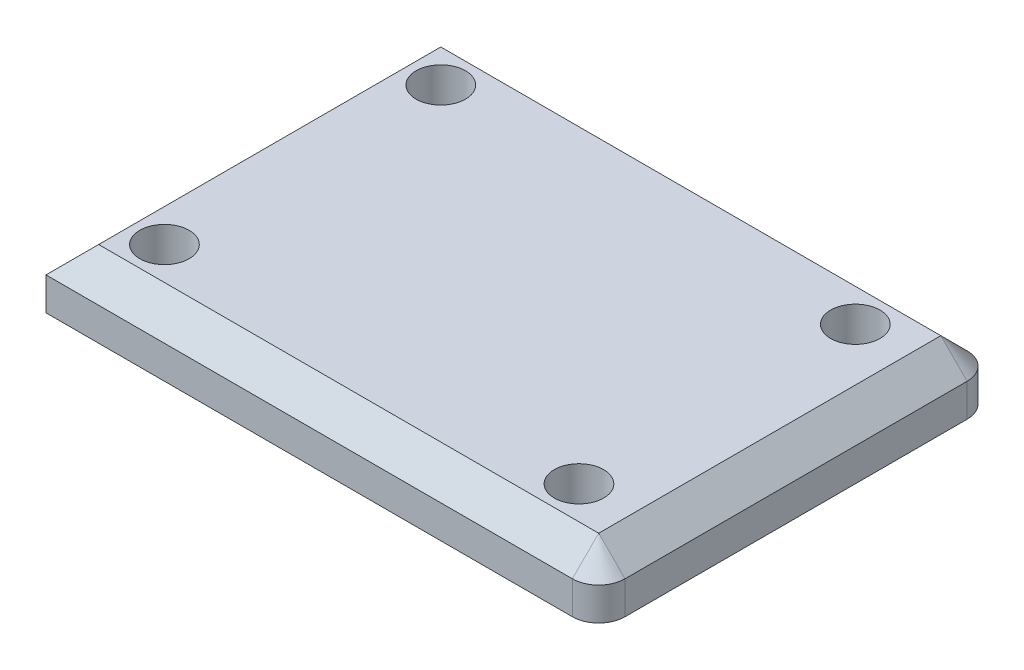
ISO-10303-21;
HEADER;
FILE_DESCRIPTION(('STEP AP214'),'2;1');
FILE_NAME('part.step','',(''),(''),'','','');
FILE_SCHEMA(('AUTOMOTIVE_DESIGN { 1 0 10303 214 1 1 1 1 }'));
ENDSEC;
DATA;
#1=APPLICATION_CONTEXT('core data for automotive mechanical design processes');
#2=APPLICATION_PROTOCOL_DEFINITION('international standard','automotive_design',2000,#1);
#3=PRODUCT_CONTEXT('',#1,'mechanical');
#4=PRODUCT('Part','Part','',(#3));
#5=PRODUCT_RELATED_PRODUCT_CATEGORY('part','',(#4));
#6=PRODUCT_DEFINITION_FORMATION('','',#4);
#7=PRODUCT_DEFINITION_CONTEXT('part definition',#1,'design');
#8=PRODUCT_DEFINITION('design','',#6,#7);
#9=PRODUCT_DEFINITION_SHAPE('','',#8);
#10=(LENGTH_UNIT() NAMED_UNIT(*) SI_UNIT(.MILLI.,.METRE.));
#11=(NAMED_UNIT(*) PLANE_ANGLE_UNIT() SI_UNIT($,.RADIAN.));
#12=(NAMED_UNIT(*) SI_UNIT($,.STERADIAN.) SOLID_ANGLE_UNIT());
#13=UNCERTAINTY_MEASURE_WITH_UNIT(LENGTH_MEASURE(1.E-05),#10,'distance_accuracy_value','');
#14=(GEOMETRIC_REPRESENTATION_CONTEXT(3) GLOBAL_UNCERTAINTY_ASSIGNED_CONTEXT((#13)) GLOBAL_UNIT_ASSIGNED_CONTEXT((#10,
#11,#12)) REPRESENTATION_CONTEXT('',''));
#15=CARTESIAN_POINT('',(0.,0.,0.));
#16=DIRECTION('',(0.,0.,1.));
#17=DIRECTION('',(1.,0.,0.));
#18=AXIS2_PLACEMENT_3D('',#15,#16,#17);
#19=CARTESIAN_POINT('',(-21.0090841155592,3.75,15.));
#20=DIRECTION('',(1.,0.,0.));
#21=DIRECTION('',(0.,0.,-1.));
#22=AXIS2_PLACEMENT_3D('',#19,#20,#21);
#23=PLANE('',#22);
#24=DIRECTION('',(0.,-1.,0.));
#25=VECTOR('',#24,1.);
#26=CARTESIAN_POINT('',(-21.0090841155592,3.75,15.));
#27=LINE('',#26,#25);
#28=CARTESIAN_POINT('',(-21.0090841155592,1.74999999999998,15.));
#29=VERTEX_POINT('',#28);
#30=CARTESIAN_POINT('',(-21.0090841155592,-0.75,15.));
#31=VERTEX_POINT('',#30);
#32=EDGE_CURVE('E106',#29,#31,#27,.T.);
#33=ORIENTED_EDGE('',*,*,#32,.F.);
#34=DIRECTION('',(0.,0.,-1.));
#35=VECTOR('',#34,1.);
#36=CARTESIAN_POINT('',(-21.0090841155592,1.74999999999998,-15.));
#37=LINE('',#36,#35);
#38=CARTESIAN_POINT('',(-21.0090841155592,1.74999999999998,-15.));
#39=VERTEX_POINT('',#38);
#40=EDGE_CURVE('E11',#29,#39,#37,.T.);
#41=ORIENTED_EDGE('',*,*,#40,.T.);
#42=DIRECTION('',(0.,-1.,0.));
#43=VECTOR('',#42,1.);
#44=CARTESIAN_POINT('',(-21.0090841155592,3.75,-15.));
#45=LINE('',#44,#43);
#46=CARTESIAN_POINT('',(-21.0090841155592,-0.75,-15.));
#47=VERTEX_POINT('',#46);
#48=EDGE_CURVE('E116',#39,#47,#45,.T.);
#49=ORIENTED_EDGE('',*,*,#48,.T.);
#50=DIRECTION('',(0.,0.,1.));
#51=VECTOR('',#50,1.);
#52=CARTESIAN_POINT('',(-21.0090841155592,-0.75,15.));
#53=LINE('',#52,#51);
#54=EDGE_CURVE('E123',#47,#31,#53,.T.);
#55=ORIENTED_EDGE('',*,*,#54,.T.);
#56=EDGE_LOOP('',(#33,#41,#49,#55));
#57=FACE_BOUND('',#56,.T.);
#58=ADVANCED_FACE('F40',(#57),#23,.F.);
#59=CARTESIAN_POINT('',(20.9909158844408,3.75,15.));
#60=DIRECTION('',(0.,0.,-1.));
#61=DIRECTION('',(-1.,0.,0.));
#62=AXIS2_PLACEMENT_3D('',#59,#60,#61);
#63=PLANE('',#62);
#64=DIRECTION('',(0.,-1.,0.));
#65=VECTOR('',#64,1.);
#66=CARTESIAN_POINT('',(18.9909158844408,3.75,15.));
#67=LINE('',#66,#65);
#68=CARTESIAN_POINT('',(18.9909158844408,-0.75,15.));
#69=VERTEX_POINT('',#68);
#70=CARTESIAN_POINT('',(18.9909158844408,1.74999999999998,15.));
#71=VERTEX_POINT('',#70);
#72=EDGE_CURVE('E148',#69,#71,#67,.F.);
#73=ORIENTED_EDGE('',*,*,#72,.T.);
#74=DIRECTION('',(-1.,0.,0.));
#75=VECTOR('',#74,1.);
#76=CARTESIAN_POINT('',(-21.0090841155592,1.74999999999998,15.));
#77=LINE('',#76,#75);
#78=EDGE_CURVE('E113',#71,#29,#77,.T.);
#79=ORIENTED_EDGE('',*,*,#78,.T.);
#80=ORIENTED_EDGE('',*,*,#32,.T.);
#81=DIRECTION('',(1.,0.,0.));
#82=VECTOR('',#81,1.);
#83=CARTESIAN_POINT('',(20.9909158844408,-0.75,15.));
#84=LINE('',#83,#82);
#85=EDGE_CURVE('E110',#31,#69,#84,.T.);
#86=ORIENTED_EDGE('',*,*,#85,.T.);
#87=EDGE_LOOP('',(#73,#79,#80,#86));
#88=FACE_BOUND('',#87,.T.);
#89=ADVANCED_FACE('F109',(#88),#63,.F.);
#90=CARTESIAN_POINT('',(20.9909158844408,3.75,15.));
#91=DIRECTION('',(-1.,0.,0.));
#92=DIRECTION('',(0.,0.,1.));
#93=AXIS2_PLACEMENT_3D('',#90,#91,#92);
#94=PLANE('',#93);
#95=DIRECTION('',(0.,-1.,0.));
#96=VECTOR('',#95,1.);
#97=CARTESIAN_POINT('',(20.9909158844408,3.75,-13.));
#98=LINE('',#97,#96);
#99=CARTESIAN_POINT('',(20.9909158844408,-0.75,-13.));
#100=VERTEX_POINT('',#99);
#101=CARTESIAN_POINT('',(20.9909158844408,1.74999999999998,-13.));
#102=VERTEX_POINT('',#101);
#103=EDGE_CURVE('E115',#100,#102,#98,.F.);
#104=ORIENTED_EDGE('',*,*,#103,.T.);
#105=DIRECTION('',(0.,0.,1.));
#106=VECTOR('',#105,1.);
#107=CARTESIAN_POINT('',(20.9909158844408,1.74999999999998,13.));
#108=LINE('',#107,#106);
#109=CARTESIAN_POINT('',(20.9909158844408,1.74999999999998,13.));
#110=VERTEX_POINT('',#109);
#111=EDGE_CURVE('E164',#102,#110,#108,.T.);
#112=ORIENTED_EDGE('',*,*,#111,.T.);
#113=DIRECTION('',(0.,-1.,0.));
#114=VECTOR('',#113,1.);
#115=CARTESIAN_POINT('',(20.9909158844408,3.75,13.));
#116=LINE('',#115,#114);
#117=CARTESIAN_POINT('',(20.9909158844408,-0.75,13.));
#118=VERTEX_POINT('',#117);
#119=EDGE_CURVE('E143',#110,#118,#116,.T.);
#120=ORIENTED_EDGE('',*,*,#119,.T.);
#121=DIRECTION('',(0.,0.,-1.));
#122=VECTOR('',#121,1.);
#123=CARTESIAN_POINT('',(20.9909158844408,-0.75,15.));
#124=LINE('',#123,#122);
#125=EDGE_CURVE('E126',#118,#100,#124,.T.);
#126=ORIENTED_EDGE('',*,*,#125,.T.);
#127=EDGE_LOOP('',(#104,#112,#120,#126));
#128=FACE_BOUND('',#127,.T.);
#129=ADVANCED_FACE('F224',(#128),#94,.F.);
#130=CARTESIAN_POINT('',(20.9909158844408,3.75,-15.));
#131=DIRECTION('',(0.,0.,1.));
#132=DIRECTION('',(1.,0.,0.));
#133=AXIS2_PLACEMENT_3D('',#130,#131,#132);
#134=PLANE('',#133);
#135=ORIENTED_EDGE('',*,*,#48,.F.);
#136=DIRECTION('',(1.,0.,0.));
#137=VECTOR('',#136,1.);
#138=CARTESIAN_POINT('',(18.9909158844408,1.74999999999998,-15.));
#139=LINE('',#138,#137);
#140=CARTESIAN_POINT('',(18.9909158844408,1.74999999999998,-15.));
#141=VERTEX_POINT('',#140);
#142=EDGE_CURVE('E50',#39,#141,#139,.T.);
#143=ORIENTED_EDGE('',*,*,#142,.T.);
#144=DIRECTION('',(0.,-1.,0.));
#145=VECTOR('',#144,1.);
#146=CARTESIAN_POINT('',(18.9909158844408,3.75,-15.));
#147=LINE('',#146,#145);
#148=CARTESIAN_POINT('',(18.9909158844408,-0.75,-15.));
#149=VERTEX_POINT('',#148);
#150=EDGE_CURVE('E150',#141,#149,#147,.T.);
#151=ORIENTED_EDGE('',*,*,#150,.T.);
#152=DIRECTION('',(-1.,0.,0.));
#153=VECTOR('',#152,1.);
#154=CARTESIAN_POINT('',(20.9909158844408,-0.75,-15.));
#155=LINE('',#154,#153);
#156=EDGE_CURVE('E138',#149,#47,#155,.T.);
#157=ORIENTED_EDGE('',*,*,#156,.T.);
#158=EDGE_LOOP('',(#135,#143,#151,#157));
#159=FACE_BOUND('',#158,.T.);
#160=ADVANCED_FACE('F215',(#159),#134,.F.);
#161=CARTESIAN_POINT('',(-0.00908411555917917,3.75,0.));
#162=DIRECTION('',(0.,1.,0.));
#163=DIRECTION('',(0.,0.,1.));
#164=AXIS2_PLACEMENT_3D('',#161,#162,#163);
#165=PLANE('',#164);
#166=DIRECTION('',(0.,0.,1.));
#167=VECTOR('',#166,1.);
#168=CARTESIAN_POINT('',(-19.0090841155592,3.75,15.));
#169=LINE('',#168,#167);
#170=CARTESIAN_POINT('',(-19.0090841155592,3.75,-13.));
#171=VERTEX_POINT('',#170);
#172=CARTESIAN_POINT('',(-19.0090841155592,3.75,13.));
#173=VERTEX_POINT('',#172);
#174=EDGE_CURVE('E152',#171,#173,#169,.T.);
#175=ORIENTED_EDGE('',*,*,#174,.T.);
#176=DIRECTION('',(1.,0.,0.));
#177=VECTOR('',#176,1.);
#178=CARTESIAN_POINT('',(18.9909158844408,3.75,13.));
#179=LINE('',#178,#177);
#180=CARTESIAN_POINT('',(18.9909158844408,3.75,13.));
#181=VERTEX_POINT('',#180);
#182=EDGE_CURVE('E158',#173,#181,#179,.T.);
#183=ORIENTED_EDGE('',*,*,#182,.T.);
#184=DIRECTION('',(0.,0.,-1.));
#185=VECTOR('',#184,1.);
#186=CARTESIAN_POINT('',(18.9909158844408,3.75,-13.));
#187=LINE('',#186,#185);
#188=CARTESIAN_POINT('',(18.9909158844408,3.75,-13.));
#189=VERTEX_POINT('',#188);
#190=EDGE_CURVE('E156',#181,#189,#187,.T.);
#191=ORIENTED_EDGE('',*,*,#190,.T.);
#192=DIRECTION('',(-1.,0.,0.));
#193=VECTOR('',#192,1.);
#194=CARTESIAN_POINT('',(-21.0090841155592,3.75,-13.));
#195=LINE('',#194,#193);
#196=EDGE_CURVE('E154',#189,#171,#195,.T.);
#197=ORIENTED_EDGE('',*,*,#196,.T.);
#198=EDGE_LOOP('',(#175,#183,#191,#197));
#199=FACE_BOUND('',#198,.T.);
#200=CARTESIAN_POINT('',(-16.5090841155592,3.75,-10.5));
#201=DIRECTION('',(0.,1.,0.));
#202=DIRECTION('',(0.,0.,1.));
#203=AXIS2_PLACEMENT_3D('',#200,#201,#202);
#204=CIRCLE('',#203,1.875);
#205=CARTESIAN_POINT('',(-16.5090841155592,3.75,-8.62500000000001));
#206=VERTEX_POINT('',#205);
#207=EDGE_CURVE('E186',#206,#206,#204,.T.);
#208=ORIENTED_EDGE('',*,*,#207,.F.);
#209=EDGE_LOOP('',(#208));
#210=FACE_BOUND('',#209,.T.);
#211=CARTESIAN_POINT('',(-16.5090841155592,3.75,10.5));
#212=DIRECTION('',(0.,1.,0.));
#213=DIRECTION('',(0.,0.,1.));
#214=AXIS2_PLACEMENT_3D('',#211,#212,#213);
#215=CIRCLE('',#214,1.875);
#216=CARTESIAN_POINT('',(-16.5090841155592,3.75,12.375));
#217=VERTEX_POINT('',#216);
#218=EDGE_CURVE('E195',#217,#217,#215,.T.);
#219=ORIENTED_EDGE('',*,*,#218,.F.);
#220=EDGE_LOOP('',(#219));
#221=FACE_BOUND('',#220,.T.);
#222=CARTESIAN_POINT('',(14.9909158844408,3.75,10.5));
#223=DIRECTION('',(0.,1.,0.));
#224=DIRECTION('',(0.,0.,1.));
#225=AXIS2_PLACEMENT_3D('',#222,#223,#224);
#226=CIRCLE('',#225,1.875);
#227=CARTESIAN_POINT('',(14.9909158844408,3.75,12.375));
#228=VERTEX_POINT('',#227);
#229=EDGE_CURVE('E203',#228,#228,#226,.T.);
#230=ORIENTED_EDGE('',*,*,#229,.F.);
#231=EDGE_LOOP('',(#230));
#232=FACE_BOUND('',#231,.T.);
#233=CARTESIAN_POINT('',(14.9909158844408,3.75,-10.5));
#234=DIRECTION('',(0.,1.,0.));
#235=DIRECTION('',(0.,0.,1.));
#236=AXIS2_PLACEMENT_3D('',#233,#234,#235);
#237=CIRCLE('',#236,1.875);
#238=CARTESIAN_POINT('',(14.9909158844408,3.75,-8.62500000000001));
#239=VERTEX_POINT('',#238);
#240=EDGE_CURVE('E132',#239,#239,#237,.T.);
#241=ORIENTED_EDGE('',*,*,#240,.F.);
#242=EDGE_LOOP('',(#241));
#243=FACE_BOUND('',#242,.T.);
#244=ADVANCED_FACE('F213',(#199,#210,#221,#232,#243),#165,.T.);
#245=CARTESIAN_POINT('',(-0.00908411555917917,-0.75,0.));
#246=DIRECTION('',(0.,1.,0.));
#247=DIRECTION('',(0.,0.,1.));
#248=AXIS2_PLACEMENT_3D('',#245,#246,#247);
#249=PLANE('',#248);
#250=CARTESIAN_POINT('',(-16.5090841155592,-0.75,-10.5));
#251=DIRECTION('',(0.,1.,0.));
#252=DIRECTION('',(0.,0.,1.));
#253=AXIS2_PLACEMENT_3D('',#250,#251,#252);
#254=CIRCLE('',#253,1.875);
#255=CARTESIAN_POINT('',(-16.5090841155592,-0.75,-8.62500000000001));
#256=VERTEX_POINT('',#255);
#257=EDGE_CURVE('E190',#256,#256,#254,.T.);
#258=ORIENTED_EDGE('',*,*,#257,.T.);
#259=EDGE_LOOP('',(#258));
#260=FACE_BOUND('',#259,.T.);
#261=CARTESIAN_POINT('',(-16.5090841155592,-0.75,10.5));
#262=DIRECTION('',(0.,1.,0.));
#263=DIRECTION('',(0.,0.,1.));
#264=AXIS2_PLACEMENT_3D('',#261,#262,#263);
#265=CIRCLE('',#264,1.875);
#266=CARTESIAN_POINT('',(-16.5090841155592,-0.75,12.375));
#267=VERTEX_POINT('',#266);
#268=EDGE_CURVE('E200',#267,#267,#265,.T.);
#269=ORIENTED_EDGE('',*,*,#268,.T.);
#270=EDGE_LOOP('',(#269));
#271=FACE_BOUND('',#270,.T.);
#272=CARTESIAN_POINT('',(14.9909158844408,-0.75,10.5));
#273=DIRECTION('',(0.,1.,0.));
#274=DIRECTION('',(0.,0.,1.));
#275=AXIS2_PLACEMENT_3D('',#272,#273,#274);
#276=CIRCLE('',#275,1.875);
#277=CARTESIAN_POINT('',(14.9909158844408,-0.75,12.375));
#278=VERTEX_POINT('',#277);
#279=EDGE_CURVE('E206',#278,#278,#276,.T.);
#280=ORIENTED_EDGE('',*,*,#279,.T.);
#281=EDGE_LOOP('',(#280));
#282=FACE_BOUND('',#281,.T.);
#283=CARTESIAN_POINT('',(14.9909158844408,-0.75,-10.5));
#284=DIRECTION('',(0.,1.,0.));
#285=DIRECTION('',(0.,0.,1.));
#286=AXIS2_PLACEMENT_3D('',#283,#284,#285);
#287=CIRCLE('',#286,1.875);
#288=CARTESIAN_POINT('',(14.9909158844408,-0.75,-8.62500000000001));
#289=VERTEX_POINT('',#288);
#290=EDGE_CURVE('E129',#289,#289,#287,.T.);
#291=ORIENTED_EDGE('',*,*,#290,.T.);
#292=EDGE_LOOP('',(#291));
#293=FACE_BOUND('',#292,.T.);
#294=ORIENTED_EDGE('',*,*,#125,.F.);
#295=CARTESIAN_POINT('',(18.9909158844408,-0.75,13.));
#296=DIRECTION('',(0.,1.,0.));
#297=DIRECTION('',(0.,0.,1.));
#298=AXIS2_PLACEMENT_3D('',#295,#296,#297);
#299=CIRCLE('',#298,2.);
#300=EDGE_CURVE('E125',#118,#69,#299,.F.);
#301=ORIENTED_EDGE('',*,*,#300,.T.);
#302=ORIENTED_EDGE('',*,*,#85,.F.);
#303=ORIENTED_EDGE('',*,*,#54,.F.);
#304=ORIENTED_EDGE('',*,*,#156,.F.);
#305=CARTESIAN_POINT('',(18.9909158844408,-0.75,-13.));
#306=DIRECTION('',(0.,1.,0.));
#307=DIRECTION('',(0.,0.,1.));
#308=AXIS2_PLACEMENT_3D('',#305,#306,#307);
#309=CIRCLE('',#308,2.);
#310=EDGE_CURVE('E145',#149,#100,#309,.F.);
#311=ORIENTED_EDGE('',*,*,#310,.T.);
#312=EDGE_LOOP('',(#294,#301,#302,#303,#304,#311));
#313=FACE_BOUND('',#312,.T.);
#314=ADVANCED_FACE('F121',(#260,#271,#282,#293,#313),#249,.F.);
#315=CARTESIAN_POINT('',(14.9909158844408,3.75,-10.5));
#316=DIRECTION('',(0.,1.,0.));
#317=DIRECTION('',(0.,0.,1.));
#318=AXIS2_PLACEMENT_3D('',#315,#316,#317);
#319=CYLINDRICAL_SURFACE('',#318,1.875);
#320=ORIENTED_EDGE('',*,*,#290,.F.);
#321=EDGE_LOOP('',(#320));
#322=FACE_BOUND('',#321,.T.);
#323=ORIENTED_EDGE('',*,*,#240,.T.);
#324=EDGE_LOOP('',(#323));
#325=FACE_BOUND('',#324,.T.);
#326=ADVANCED_FACE('F211',(#322,#325),#319,.F.);
#327=CARTESIAN_POINT('',(14.9909158844408,3.75,10.5));
#328=DIRECTION('',(0.,1.,0.));
#329=DIRECTION('',(0.,0.,1.));
#330=AXIS2_PLACEMENT_3D('',#327,#328,#329);
#331=CYLINDRICAL_SURFACE('',#330,1.875);
#332=ORIENTED_EDGE('',*,*,#279,.F.);
#333=EDGE_LOOP('',(#332));
#334=FACE_BOUND('',#333,.T.);
#335=ORIENTED_EDGE('',*,*,#229,.T.);
#336=EDGE_LOOP('',(#335));
#337=FACE_BOUND('',#336,.T.);
#338=ADVANCED_FACE('F372',(#334,#337),#331,.F.);
#339=CARTESIAN_POINT('',(-16.5090841155592,3.75,10.5));
#340=DIRECTION('',(0.,1.,0.));
#341=DIRECTION('',(0.,0.,1.));
#342=AXIS2_PLACEMENT_3D('',#339,#340,#341);
#343=CYLINDRICAL_SURFACE('',#342,1.875);
#344=ORIENTED_EDGE('',*,*,#268,.F.);
#345=EDGE_LOOP('',(#344));
#346=FACE_BOUND('',#345,.T.);
#347=ORIENTED_EDGE('',*,*,#218,.T.);
#348=EDGE_LOOP('',(#347));
#349=FACE_BOUND('',#348,.T.);
#350=ADVANCED_FACE('F363',(#346,#349),#343,.F.);
#351=CARTESIAN_POINT('',(-16.5090841155592,3.75,-10.5));
#352=DIRECTION('',(0.,1.,0.));
#353=DIRECTION('',(0.,0.,1.));
#354=AXIS2_PLACEMENT_3D('',#351,#352,#353);
#355=CYLINDRICAL_SURFACE('',#354,1.875);
#356=ORIENTED_EDGE('',*,*,#257,.F.);
#357=EDGE_LOOP('',(#356));
#358=FACE_BOUND('',#357,.T.);
#359=ORIENTED_EDGE('',*,*,#207,.T.);
#360=EDGE_LOOP('',(#359));
#361=FACE_BOUND('',#360,.T.);
#362=ADVANCED_FACE('F240',(#358,#361),#355,.F.);
#363=CARTESIAN_POINT('',(18.9909158844408,3.75,13.));
#364=DIRECTION('',(0.,-1.,0.));
#365=DIRECTION('',(0.,0.,-1.));
#366=AXIS2_PLACEMENT_3D('',#363,#364,#365);
#367=CYLINDRICAL_SURFACE('',#366,2.);
#368=ORIENTED_EDGE('',*,*,#119,.F.);
#369=CARTESIAN_POINT('',(18.9909158844408,1.74999999999998,13.));
#370=DIRECTION('',(0.,1.,0.));
#371=DIRECTION('',(0.,0.,1.));
#372=AXIS2_PLACEMENT_3D('',#369,#370,#371);
#373=CIRCLE('',#372,2.);
#374=EDGE_CURVE('E162',#110,#71,#373,.F.);
#375=ORIENTED_EDGE('',*,*,#374,.T.);
#376=ORIENTED_EDGE('',*,*,#72,.F.);
#377=ORIENTED_EDGE('',*,*,#300,.F.);
#378=EDGE_LOOP('',(#368,#375,#376,#377));
#379=FACE_BOUND('',#378,.T.);
#380=ADVANCED_FACE('F236',(#379),#367,.T.);
#381=CARTESIAN_POINT('',(18.9909158844408,3.75,-13.));
#382=DIRECTION('',(0.,-1.,0.));
#383=DIRECTION('',(0.,0.,-1.));
#384=AXIS2_PLACEMENT_3D('',#381,#382,#383);
#385=CYLINDRICAL_SURFACE('',#384,2.);
#386=ORIENTED_EDGE('',*,*,#150,.F.);
#387=CARTESIAN_POINT('',(18.9909158844408,1.74999999999998,-13.));
#388=DIRECTION('',(0.,1.,0.));
#389=DIRECTION('',(0.,0.,1.));
#390=AXIS2_PLACEMENT_3D('',#387,#388,#389);
#391=CIRCLE('',#390,2.);
#392=EDGE_CURVE('E166',#141,#102,#391,.F.);
#393=ORIENTED_EDGE('',*,*,#392,.T.);
#394=ORIENTED_EDGE('',*,*,#103,.F.);
#395=ORIENTED_EDGE('',*,*,#310,.F.);
#396=EDGE_LOOP('',(#386,#393,#394,#395));
#397=FACE_BOUND('',#396,.T.);
#398=ADVANCED_FACE('F239',(#397),#385,.T.);
#399=CARTESIAN_POINT('',(18.9909158844408,1.74999999999998,-13.));
#400=DIRECTION('',(0.,-1.,0.));
#401=DIRECTION('',(0.,0.,-1.));
#402=AXIS2_PLACEMENT_3D('',#399,#400,#401);
#403=CONICAL_SURFACE('',#402,2.00000000000001,0.785398163397447);
#404=DIRECTION('',(-0.707106781186546,0.707106781186549,0.));
#405=VECTOR('',#404,1.);
#406=CARTESIAN_POINT('',(20.9909158844408,1.74999999999998,-13.));
#407=LINE('',#406,#405);
#408=EDGE_CURVE('E178',#102,#189,#407,.T.);
#409=ORIENTED_EDGE('',*,*,#408,.F.);
#410=ORIENTED_EDGE('',*,*,#392,.F.);
#411=DIRECTION('',(0.,-0.707106781186549,-0.707106781186546));
#412=VECTOR('',#411,1.);
#413=CARTESIAN_POINT('',(18.9909158844408,3.75,-13.));
#414=LINE('',#413,#412);
#415=EDGE_CURVE('E45',#189,#141,#414,.T.);
#416=ORIENTED_EDGE('',*,*,#415,.F.);
#417=EDGE_LOOP('',(#409,#410,#416));
#418=FACE_BOUND('',#417,.T.);
#419=ADVANCED_FACE('F43',(#418),#403,.T.);
#420=CARTESIAN_POINT('',(-0.00908411555918078,3.75,-13.));
#421=DIRECTION('',(0.,0.707106781186546,-0.707106781186549));
#422=DIRECTION('',(1.,0.,0.));
#423=AXIS2_PLACEMENT_3D('',#420,#421,#422);
#424=PLANE('',#423);
#425=ORIENTED_EDGE('',*,*,#415,.T.);
#426=ORIENTED_EDGE('',*,*,#142,.F.);
#427=DIRECTION('',(-0.577350269189625,-0.577350269189627,-0.577350269189625));
#428=VECTOR('',#427,1.);
#429=CARTESIAN_POINT('',(-14.6757507822259,8.08333333333333,-8.66666666666667));
#430=LINE('',#429,#428);
#431=EDGE_CURVE('E176',#171,#39,#430,.T.);
#432=ORIENTED_EDGE('',*,*,#431,.F.);
#433=ORIENTED_EDGE('',*,*,#196,.F.);
#434=EDGE_LOOP('',(#425,#426,#432,#433));
#435=FACE_BOUND('',#434,.T.);
#436=ADVANCED_FACE('F272',(#435),#424,.T.);
#437=CARTESIAN_POINT('',(18.9909158844408,3.75,0.));
#438=DIRECTION('',(0.707106781186549,0.707106781186546,0.));
#439=DIRECTION('',(0.,0.,1.));
#440=AXIS2_PLACEMENT_3D('',#437,#438,#439);
#441=PLANE('',#440);
#442=ORIENTED_EDGE('',*,*,#408,.T.);
#443=ORIENTED_EDGE('',*,*,#190,.F.);
#444=DIRECTION('',(-0.707106781186546,0.707106781186549,0.));
#445=VECTOR('',#444,1.);
#446=CARTESIAN_POINT('',(20.9909158844408,1.74999999999998,13.));
#447=LINE('',#446,#445);
#448=EDGE_CURVE('E173',#110,#181,#447,.T.);
#449=ORIENTED_EDGE('',*,*,#448,.F.);
#450=ORIENTED_EDGE('',*,*,#111,.F.);
#451=EDGE_LOOP('',(#442,#443,#449,#450));
#452=FACE_BOUND('',#451,.T.);
#453=ADVANCED_FACE('F266',(#452),#441,.T.);
#454=CARTESIAN_POINT('',(-19.0090841155592,3.75,0.));
#455=DIRECTION('',(-0.707106781186549,0.707106781186546,0.));
#456=DIRECTION('',(0.,0.,-1.));
#457=AXIS2_PLACEMENT_3D('',#454,#455,#456);
#458=PLANE('',#457);
#459=ORIENTED_EDGE('',*,*,#431,.T.);
#460=ORIENTED_EDGE('',*,*,#40,.F.);
#461=DIRECTION('',(0.577350269189625,0.577350269189627,-0.577350269189625));
#462=VECTOR('',#461,1.);
#463=CARTESIAN_POINT('',(-14.6757507822259,8.08333333333333,8.66666666666667));
#464=LINE('',#463,#462);
#465=EDGE_CURVE('E171',#173,#29,#464,.F.);
#466=ORIENTED_EDGE('',*,*,#465,.F.);
#467=ORIENTED_EDGE('',*,*,#174,.F.);
#468=EDGE_LOOP('',(#459,#460,#466,#467));
#469=FACE_BOUND('',#468,.T.);
#470=ADVANCED_FACE('F259',(#469),#458,.T.);
#471=CARTESIAN_POINT('',(18.9909158844408,1.74999999999998,13.));
#472=DIRECTION('',(0.,-1.,0.));
#473=DIRECTION('',(0.,0.,-1.));
#474=AXIS2_PLACEMENT_3D('',#471,#472,#473);
#475=CONICAL_SURFACE('',#474,2.00000000000001,0.785398163397447);
#476=ORIENTED_EDGE('',*,*,#374,.F.);
#477=ORIENTED_EDGE('',*,*,#448,.T.);
#478=DIRECTION('',(0.,0.707106781186549,-0.707106781186546));
#479=VECTOR('',#478,1.);
#480=CARTESIAN_POINT('',(18.9909158844408,1.74999999999998,15.));
#481=LINE('',#480,#479);
#482=EDGE_CURVE('E169',#71,#181,#481,.T.);
#483=ORIENTED_EDGE('',*,*,#482,.F.);
#484=EDGE_LOOP('',(#476,#477,#483));
#485=FACE_BOUND('',#484,.T.);
#486=ADVANCED_FACE('F252',(#485),#475,.T.);
#487=CARTESIAN_POINT('',(-0.00908411555917756,3.75,13.));
#488=DIRECTION('',(0.,0.707106781186546,0.707106781186549));
#489=DIRECTION('',(-1.,0.,0.));
#490=AXIS2_PLACEMENT_3D('',#487,#488,#489);
#491=PLANE('',#490);
#492=ORIENTED_EDGE('',*,*,#465,.T.);
#493=ORIENTED_EDGE('',*,*,#78,.F.);
#494=ORIENTED_EDGE('',*,*,#482,.T.);
#495=ORIENTED_EDGE('',*,*,#182,.F.);
#496=EDGE_LOOP('',(#492,#493,#494,#495));
#497=FACE_BOUND('',#496,.T.);
#498=ADVANCED_FACE('F246',(#497),#491,.T.);
#499=CLOSED_SHELL('',(#58,#89,#129,#160,#244,#314,#326,#338,#350,#362,#380,#398,#419,#436,#453,
#470,#486,#498));
#500=MANIFOLD_SOLID_BREP('B2',#499);
#501=ADVANCED_BREP_SHAPE_REPRESENTATION('',(#18,#500),#14);
#502=SHAPE_DEFINITION_REPRESENTATION(#9,#501);
ENDSEC;
END-ISO-10303-21;
